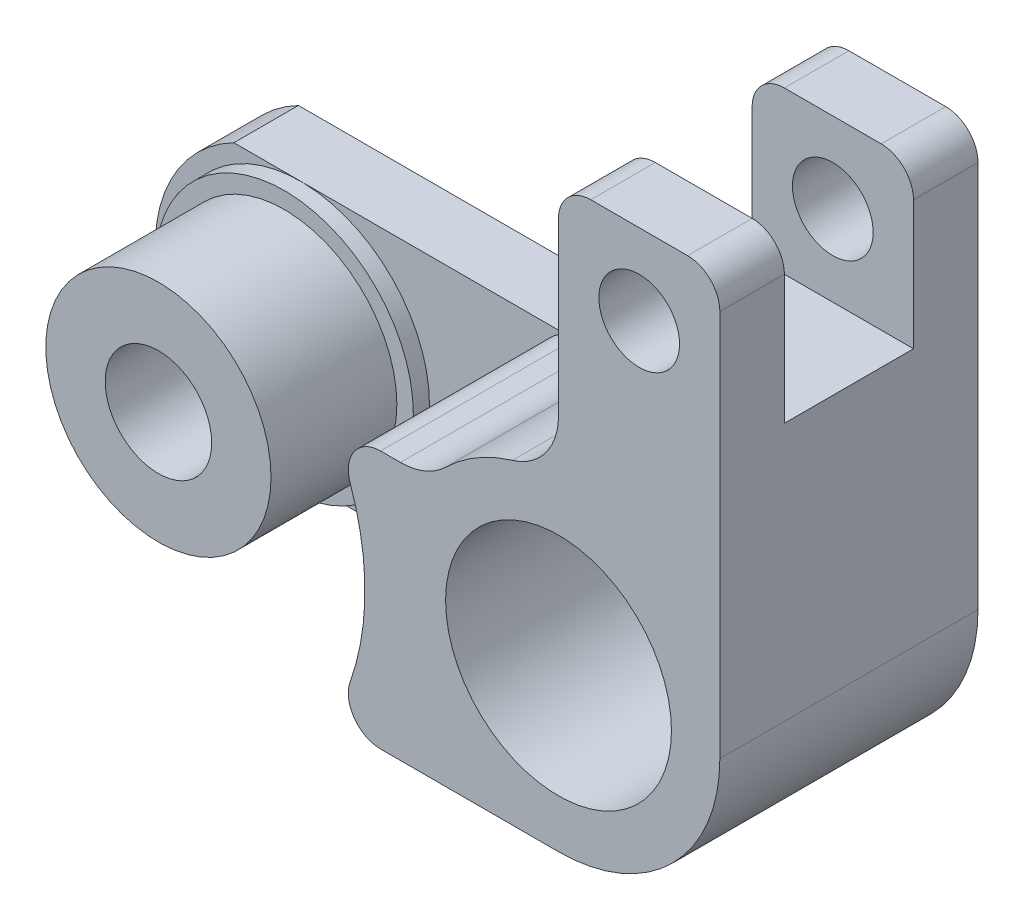
ISO-10303-21;
HEADER;
FILE_DESCRIPTION(('STEP AP214'),'2;1');
FILE_NAME('part.step','',(''),(''),'','','');
FILE_SCHEMA(('AUTOMOTIVE_DESIGN { 1 0 10303 214 1 1 1 1 }'));
ENDSEC;
DATA;
#1=APPLICATION_CONTEXT('core data for automotive mechanical design processes');
#2=APPLICATION_PROTOCOL_DEFINITION('international standard','automotive_design',2000,#1);
#3=PRODUCT_CONTEXT('',#1,'mechanical');
#4=PRODUCT('Part','Part','',(#3));
#5=PRODUCT_RELATED_PRODUCT_CATEGORY('part','',(#4));
#6=PRODUCT_DEFINITION_FORMATION('','',#4);
#7=PRODUCT_DEFINITION_CONTEXT('part definition',#1,'design');
#8=PRODUCT_DEFINITION('design','',#6,#7);
#9=PRODUCT_DEFINITION_SHAPE('','',#8);
#10=(LENGTH_UNIT() NAMED_UNIT(*) SI_UNIT(.MILLI.,.METRE.));
#11=(NAMED_UNIT(*) PLANE_ANGLE_UNIT() SI_UNIT($,.RADIAN.));
#12=(NAMED_UNIT(*) SI_UNIT($,.STERADIAN.) SOLID_ANGLE_UNIT());
#13=UNCERTAINTY_MEASURE_WITH_UNIT(LENGTH_MEASURE(1.E-05),#10,'distance_accuracy_value','');
#14=(GEOMETRIC_REPRESENTATION_CONTEXT(3) GLOBAL_UNCERTAINTY_ASSIGNED_CONTEXT((#13)) GLOBAL_UNIT_ASSIGNED_CONTEXT((#10,
#11,#12)) REPRESENTATION_CONTEXT('',''));
#15=CARTESIAN_POINT('',(0.,0.,0.));
#16=DIRECTION('',(0.,0.,1.));
#17=DIRECTION('',(1.,0.,0.));
#18=AXIS2_PLACEMENT_3D('',#15,#16,#17);
#19=CARTESIAN_POINT('',(5.,4.,2.5));
#20=DIRECTION('',(0.,0.,1.));
#21=DIRECTION('',(1.,0.,0.));
#22=AXIS2_PLACEMENT_3D('',#19,#20,#21);
#23=PLANE('',#22);
#24=CARTESIAN_POINT('',(5.,4.,2.5));
#25=DIRECTION('',(0.,0.,1.));
#26=DIRECTION('',(1.,0.,0.));
#27=AXIS2_PLACEMENT_3D('',#24,#25,#26);
#28=CIRCLE('',#27,4.);
#29=CARTESIAN_POINT('',(9.,4.,2.5));
#30=VERTEX_POINT('',#29);
#31=EDGE_CURVE('E11',#30,#30,#28,.T.);
#32=ORIENTED_EDGE('',*,*,#31,.T.);
#33=EDGE_LOOP('',(#32));
#34=FACE_BOUND('',#33,.T.);
#35=CARTESIAN_POINT('',(5.,4.,2.5));
#36=DIRECTION('',(0.,0.,1.));
#37=DIRECTION('',(1.,0.,0.));
#38=AXIS2_PLACEMENT_3D('',#35,#36,#37);
#39=CIRCLE('',#38,3.49);
#40=CARTESIAN_POINT('',(8.49,4.,2.5));
#41=VERTEX_POINT('',#40);
#42=EDGE_CURVE('E54',#41,#41,#39,.T.);
#43=ORIENTED_EDGE('',*,*,#42,.F.);
#44=EDGE_LOOP('',(#43));
#45=FACE_BOUND('',#44,.T.);
#46=ADVANCED_FACE('F43',(#34,#45),#23,.T.);
#47=CARTESIAN_POINT('',(5.,4.,2.));
#48=DIRECTION('',(0.,0.,1.));
#49=DIRECTION('',(1.,0.,0.));
#50=AXIS2_PLACEMENT_3D('',#47,#48,#49);
#51=PLANE('',#50);
#52=CARTESIAN_POINT('',(5.,4.,2.));
#53=DIRECTION('',(0.,0.,1.));
#54=DIRECTION('',(1.,0.,0.));
#55=AXIS2_PLACEMENT_3D('',#52,#53,#54);
#56=CIRCLE('',#55,4.);
#57=CARTESIAN_POINT('',(9.,4.,2.));
#58=VERTEX_POINT('',#57);
#59=EDGE_CURVE('E47',#58,#58,#56,.T.);
#60=ORIENTED_EDGE('',*,*,#59,.F.);
#61=EDGE_LOOP('',(#60));
#62=FACE_BOUND('',#61,.T.);
#63=CARTESIAN_POINT('',(5.,4.,2.));
#64=DIRECTION('',(0.,0.,1.));
#65=DIRECTION('',(1.,0.,0.));
#66=AXIS2_PLACEMENT_3D('',#63,#64,#65);
#67=CIRCLE('',#66,3.49);
#68=CARTESIAN_POINT('',(8.49,4.,2.));
#69=VERTEX_POINT('',#68);
#70=EDGE_CURVE('E56',#69,#69,#67,.T.);
#71=ORIENTED_EDGE('',*,*,#70,.T.);
#72=EDGE_LOOP('',(#71));
#73=FACE_BOUND('',#72,.T.);
#74=ADVANCED_FACE('F66',(#62,#73),#51,.F.);
#75=CARTESIAN_POINT('',(5.,4.,2.5));
#76=DIRECTION('',(0.,0.,-1.));
#77=DIRECTION('',(-1.,0.,0.));
#78=AXIS2_PLACEMENT_3D('',#75,#76,#77);
#79=CYLINDRICAL_SURFACE('',#78,4.);
#80=ORIENTED_EDGE('',*,*,#59,.T.);
#81=EDGE_LOOP('',(#80));
#82=FACE_BOUND('',#81,.T.);
#83=ORIENTED_EDGE('',*,*,#31,.F.);
#84=EDGE_LOOP('',(#83));
#85=FACE_BOUND('',#84,.T.);
#86=ADVANCED_FACE('F45',(#82,#85),#79,.T.);
#87=CARTESIAN_POINT('',(5.,4.,2.5));
#88=DIRECTION('',(0.,0.,-1.));
#89=DIRECTION('',(-1.,0.,0.));
#90=AXIS2_PLACEMENT_3D('',#87,#88,#89);
#91=CYLINDRICAL_SURFACE('',#90,3.49);
#92=ORIENTED_EDGE('',*,*,#42,.T.);
#93=EDGE_LOOP('',(#92));
#94=FACE_BOUND('',#93,.T.);
#95=ORIENTED_EDGE('',*,*,#70,.F.);
#96=EDGE_LOOP('',(#95));
#97=FACE_BOUND('',#96,.T.);
#98=ADVANCED_FACE('F62',(#94,#97),#91,.F.);
#99=CLOSED_SHELL('',(#46,#74,#86,#98));
#100=MANIFOLD_SOLID_BREP('B2',#99);
#101=CARTESIAN_POINT('',(24.,18.,8.));
#102=DIRECTION('',(0.,-1.,0.));
#103=DIRECTION('',(1.,0.,0.));
#104=AXIS2_PLACEMENT_3D('',#101,#102,#103);
#105=PLANE('',#104);
#106=DIRECTION('',(0.,0.,-1.));
#107=VECTOR('',#106,1.);
#108=CARTESIAN_POINT('',(23.,18.,8.));
#109=LINE('',#108,#107);
#110=CARTESIAN_POINT('',(23.,18.,8.));
#111=VERTEX_POINT('',#110);
#112=CARTESIAN_POINT('',(23.,18.,6.));
#113=VERTEX_POINT('',#112);
#114=EDGE_CURVE('E389',#111,#113,#109,.T.);
#115=ORIENTED_EDGE('',*,*,#114,.T.);
#116=DIRECTION('',(1.,0.,0.));
#117=VECTOR('',#116,1.);
#118=CARTESIAN_POINT('',(19.,18.,6.));
#119=LINE('',#118,#117);
#120=CARTESIAN_POINT('',(20.,18.,6.));
#121=VERTEX_POINT('',#120);
#122=EDGE_CURVE('E284',#121,#113,#119,.T.);
#123=ORIENTED_EDGE('',*,*,#122,.F.);
#124=DIRECTION('',(0.,0.,-1.));
#125=VECTOR('',#124,1.);
#126=CARTESIAN_POINT('',(20.,18.,8.));
#127=LINE('',#126,#125);
#128=CARTESIAN_POINT('',(20.,18.,8.));
#129=VERTEX_POINT('',#128);
#130=EDGE_CURVE('E384',#121,#129,#127,.F.);
#131=ORIENTED_EDGE('',*,*,#130,.T.);
#132=DIRECTION('',(-1.,0.,0.));
#133=VECTOR('',#132,1.);
#134=CARTESIAN_POINT('',(24.,18.,8.));
#135=LINE('',#134,#133);
#136=EDGE_CURVE('E342',#111,#129,#135,.T.);
#137=ORIENTED_EDGE('',*,*,#136,.F.);
#138=EDGE_LOOP('',(#115,#123,#131,#137));
#139=FACE_BOUND('',#138,.T.);
#140=ADVANCED_FACE('F105',(#139),#105,.F.);
#141=CARTESIAN_POINT('',(23.,17.,8.));
#142=DIRECTION('',(0.,0.,-1.));
#143=DIRECTION('',(-1.,0.,0.));
#144=AXIS2_PLACEMENT_3D('',#141,#142,#143);
#145=CYLINDRICAL_SURFACE('',#144,1.);
#146=CARTESIAN_POINT('',(23.,17.,6.));
#147=DIRECTION('',(0.,0.,1.));
#148=DIRECTION('',(1.,0.,0.));
#149=AXIS2_PLACEMENT_3D('',#146,#147,#148);
#150=CIRCLE('',#149,1.);
#151=CARTESIAN_POINT('',(24.,17.,6.));
#152=VERTEX_POINT('',#151);
#153=EDGE_CURVE('E259',#113,#152,#150,.F.);
#154=ORIENTED_EDGE('',*,*,#153,.F.);
#155=ORIENTED_EDGE('',*,*,#114,.F.);
#156=CARTESIAN_POINT('',(23.,17.,8.));
#157=DIRECTION('',(0.,0.,1.));
#158=DIRECTION('',(1.,0.,0.));
#159=AXIS2_PLACEMENT_3D('',#156,#157,#158);
#160=CIRCLE('',#159,1.);
#161=CARTESIAN_POINT('',(24.,17.,8.));
#162=VERTEX_POINT('',#161);
#163=EDGE_CURVE('E405',#162,#111,#160,.T.);
#164=ORIENTED_EDGE('',*,*,#163,.F.);
#165=DIRECTION('',(0.,0.,-1.));
#166=VECTOR('',#165,1.);
#167=CARTESIAN_POINT('',(24.,17.,8.));
#168=LINE('',#167,#166);
#169=EDGE_CURVE('E396',#152,#162,#168,.F.);
#170=ORIENTED_EDGE('',*,*,#169,.F.);
#171=EDGE_LOOP('',(#154,#155,#164,#170));
#172=FACE_BOUND('',#171,.T.);
#173=ADVANCED_FACE('F508',(#172),#145,.T.);
#174=CARTESIAN_POINT('',(20.,17.,8.));
#175=DIRECTION('',(0.,0.,-1.));
#176=DIRECTION('',(-1.,0.,0.));
#177=AXIS2_PLACEMENT_3D('',#174,#175,#176);
#178=CYLINDRICAL_SURFACE('',#177,1.);
#179=CARTESIAN_POINT('',(20.,17.,6.));
#180=DIRECTION('',(0.,0.,1.));
#181=DIRECTION('',(1.,0.,0.));
#182=AXIS2_PLACEMENT_3D('',#179,#180,#181);
#183=CIRCLE('',#182,1.);
#184=CARTESIAN_POINT('',(19.,17.,6.));
#185=VERTEX_POINT('',#184);
#186=EDGE_CURVE('E428',#185,#121,#183,.F.);
#187=ORIENTED_EDGE('',*,*,#186,.F.);
#188=DIRECTION('',(0.,0.,-1.));
#189=VECTOR('',#188,1.);
#190=CARTESIAN_POINT('',(19.,17.,8.));
#191=LINE('',#190,#189);
#192=CARTESIAN_POINT('',(19.,17.,8.));
#193=VERTEX_POINT('',#192);
#194=EDGE_CURVE('E408',#193,#185,#191,.T.);
#195=ORIENTED_EDGE('',*,*,#194,.F.);
#196=CARTESIAN_POINT('',(20.,17.,8.));
#197=DIRECTION('',(0.,0.,1.));
#198=DIRECTION('',(1.,0.,0.));
#199=AXIS2_PLACEMENT_3D('',#196,#197,#198);
#200=CIRCLE('',#199,1.);
#201=EDGE_CURVE('E403',#129,#193,#200,.T.);
#202=ORIENTED_EDGE('',*,*,#201,.F.);
#203=ORIENTED_EDGE('',*,*,#130,.F.);
#204=EDGE_LOOP('',(#187,#195,#202,#203));
#205=FACE_BOUND('',#204,.T.);
#206=ADVANCED_FACE('F515',(#205),#178,.T.);
#207=CARTESIAN_POINT('',(0.,0.,8.));
#208=DIRECTION('',(0.,1.,0.));
#209=DIRECTION('',(0.,0.,1.));
#210=AXIS2_PLACEMENT_3D('',#207,#208,#209);
#211=PLANE('',#210);
#212=DIRECTION('',(1.,0.,0.));
#213=VECTOR('',#212,1.);
#214=CARTESIAN_POINT('',(0.,0.,8.));
#215=LINE('',#214,#213);
#216=CARTESIAN_POINT('',(13.4852813742386,0.,8.));
#217=VERTEX_POINT('',#216);
#218=CARTESIAN_POINT('',(19.,0.,8.));
#219=VERTEX_POINT('',#218);
#220=EDGE_CURVE('E336',#217,#219,#215,.T.);
#221=ORIENTED_EDGE('',*,*,#220,.F.);
#222=DIRECTION('',(0.,0.,1.));
#223=VECTOR('',#222,1.);
#224=CARTESIAN_POINT('',(13.4852813742386,0.,8.));
#225=LINE('',#224,#223);
#226=CARTESIAN_POINT('',(13.4852813742386,0.,2.));
#227=VERTEX_POINT('',#226);
#228=EDGE_CURVE('E418',#217,#227,#225,.F.);
#229=ORIENTED_EDGE('',*,*,#228,.T.);
#230=DIRECTION('',(1.,0.,0.));
#231=VECTOR('',#230,1.);
#232=CARTESIAN_POINT('',(0.,0.,2.));
#233=LINE('',#232,#231);
#234=CARTESIAN_POINT('',(2.93844718719117,0.,2.));
#235=VERTEX_POINT('',#234);
#236=EDGE_CURVE('E318',#235,#227,#233,.T.);
#237=ORIENTED_EDGE('',*,*,#236,.F.);
#238=DIRECTION('',(0.,0.,1.));
#239=VECTOR('',#238,1.);
#240=CARTESIAN_POINT('',(2.93844718719117,0.,0.));
#241=LINE('',#240,#239);
#242=CARTESIAN_POINT('',(2.93844718719117,0.,0.));
#243=VERTEX_POINT('',#242);
#244=EDGE_CURVE('E301',#243,#235,#241,.T.);
#245=ORIENTED_EDGE('',*,*,#244,.F.);
#246=DIRECTION('',(1.,0.,0.));
#247=VECTOR('',#246,1.);
#248=CARTESIAN_POINT('',(0.,0.,0.));
#249=LINE('',#248,#247);
#250=CARTESIAN_POINT('',(19.,0.,0.));
#251=VERTEX_POINT('',#250);
#252=EDGE_CURVE('E334',#243,#251,#249,.T.);
#253=ORIENTED_EDGE('',*,*,#252,.T.);
#254=DIRECTION('',(0.,0.,-1.));
#255=VECTOR('',#254,1.);
#256=CARTESIAN_POINT('',(19.,0.,8.));
#257=LINE('',#256,#255);
#258=EDGE_CURVE('E379',#251,#219,#257,.F.);
#259=ORIENTED_EDGE('',*,*,#258,.T.);
#260=EDGE_LOOP('',(#221,#229,#237,#245,#253,#259));
#261=FACE_BOUND('',#260,.T.);
#262=ADVANCED_FACE('F481',(#261),#211,.F.);
#263=CARTESIAN_POINT('',(24.,0.,8.));
#264=DIRECTION('',(-1.,0.,0.));
#265=DIRECTION('',(0.,0.,1.));
#266=AXIS2_PLACEMENT_3D('',#263,#264,#265);
#267=PLANE('',#266);
#268=DIRECTION('',(0.,0.,-1.));
#269=VECTOR('',#268,1.);
#270=CARTESIAN_POINT('',(24.,13.,2.));
#271=LINE('',#270,#269);
#272=CARTESIAN_POINT('',(24.,13.,6.));
#273=VERTEX_POINT('',#272);
#274=CARTESIAN_POINT('',(24.,13.,2.));
#275=VERTEX_POINT('',#274);
#276=EDGE_CURVE('E270',#273,#275,#271,.T.);
#277=ORIENTED_EDGE('',*,*,#276,.F.);
#278=DIRECTION('',(0.,1.,0.));
#279=VECTOR('',#278,1.);
#280=CARTESIAN_POINT('',(24.,13.,6.));
#281=LINE('',#280,#279);
#282=EDGE_CURVE('E253',#273,#152,#281,.T.);
#283=ORIENTED_EDGE('',*,*,#282,.T.);
#284=ORIENTED_EDGE('',*,*,#169,.T.);
#285=DIRECTION('',(0.,1.,0.));
#286=VECTOR('',#285,1.);
#287=CARTESIAN_POINT('',(24.,0.,8.));
#288=LINE('',#287,#286);
#289=CARTESIAN_POINT('',(24.,5.,8.));
#290=VERTEX_POINT('',#289);
#291=EDGE_CURVE('E338',#290,#162,#288,.T.);
#292=ORIENTED_EDGE('',*,*,#291,.F.);
#293=DIRECTION('',(0.,0.,-1.));
#294=VECTOR('',#293,1.);
#295=CARTESIAN_POINT('',(24.,5.,8.));
#296=LINE('',#295,#294);
#297=CARTESIAN_POINT('',(24.,5.,0.));
#298=VERTEX_POINT('',#297);
#299=EDGE_CURVE('E374',#290,#298,#296,.T.);
#300=ORIENTED_EDGE('',*,*,#299,.T.);
#301=DIRECTION('',(0.,1.,0.));
#302=VECTOR('',#301,1.);
#303=CARTESIAN_POINT('',(24.,0.,0.));
#304=LINE('',#303,#302);
#305=CARTESIAN_POINT('',(24.,17.,0.));
#306=VERTEX_POINT('',#305);
#307=EDGE_CURVE('E353',#298,#306,#304,.T.);
#308=ORIENTED_EDGE('',*,*,#307,.T.);
#309=CARTESIAN_POINT('',(24.,17.,2.));
#310=VERTEX_POINT('',#309);
#311=EDGE_CURVE('E397',#306,#310,#168,.F.);
#312=ORIENTED_EDGE('',*,*,#311,.T.);
#313=DIRECTION('',(0.,1.,0.));
#314=VECTOR('',#313,1.);
#315=CARTESIAN_POINT('',(24.,13.,2.));
#316=LINE('',#315,#314);
#317=EDGE_CURVE('E263',#275,#310,#316,.T.);
#318=ORIENTED_EDGE('',*,*,#317,.F.);
#319=EDGE_LOOP('',(#277,#283,#284,#292,#300,#308,#312,#318));
#320=FACE_BOUND('',#319,.T.);
#321=ADVANCED_FACE('F276',(#320),#267,.F.);
#322=CARTESIAN_POINT('',(20.,18.,0.));
#323=VERTEX_POINT('',#322);
#324=CARTESIAN_POINT('',(20.,18.,2.));
#325=VERTEX_POINT('',#324);
#326=EDGE_CURVE('E385',#323,#325,#127,.F.);
#327=ORIENTED_EDGE('',*,*,#326,.T.);
#328=DIRECTION('',(-1.,0.,0.));
#329=VECTOR('',#328,1.);
#330=CARTESIAN_POINT('',(19.,18.,2.));
#331=LINE('',#330,#329);
#332=CARTESIAN_POINT('',(23.,18.,2.));
#333=VERTEX_POINT('',#332);
#334=EDGE_CURVE('E274',#333,#325,#331,.T.);
#335=ORIENTED_EDGE('',*,*,#334,.F.);
#336=CARTESIAN_POINT('',(23.,18.,0.));
#337=VERTEX_POINT('',#336);
#338=EDGE_CURVE('E388',#333,#337,#109,.T.);
#339=ORIENTED_EDGE('',*,*,#338,.T.);
#340=DIRECTION('',(-1.,0.,0.));
#341=VECTOR('',#340,1.);
#342=CARTESIAN_POINT('',(24.,18.,0.));
#343=LINE('',#342,#341);
#344=EDGE_CURVE('E356',#337,#323,#343,.T.);
#345=ORIENTED_EDGE('',*,*,#344,.T.);
#346=EDGE_LOOP('',(#327,#335,#339,#345));
#347=FACE_BOUND('',#346,.T.);
#348=ADVANCED_FACE('F511',(#347),#105,.F.);
#349=CARTESIAN_POINT('',(19.,18.,8.));
#350=DIRECTION('',(1.,0.,0.));
#351=DIRECTION('',(0.,0.,-1.));
#352=AXIS2_PLACEMENT_3D('',#349,#350,#351);
#353=PLANE('',#352);
#354=DIRECTION('',(0.,-1.,0.));
#355=VECTOR('',#354,1.);
#356=CARTESIAN_POINT('',(19.,18.,0.));
#357=LINE('',#356,#355);
#358=CARTESIAN_POINT('',(19.,17.,0.));
#359=VERTEX_POINT('',#358);
#360=CARTESIAN_POINT('',(19.,11.7082039324994,0.));
#361=VERTEX_POINT('',#360);
#362=EDGE_CURVE('E359',#359,#361,#357,.T.);
#363=ORIENTED_EDGE('',*,*,#362,.T.);
#364=DIRECTION('',(0.,0.,1.));
#365=VECTOR('',#364,1.);
#366=CARTESIAN_POINT('',(19.,11.7082039324994,8.));
#367=LINE('',#366,#365);
#368=CARTESIAN_POINT('',(19.,11.7082039324994,8.));
#369=VERTEX_POINT('',#368);
#370=EDGE_CURVE('E430',#361,#369,#367,.T.);
#371=ORIENTED_EDGE('',*,*,#370,.T.);
#372=DIRECTION('',(0.,-1.,0.));
#373=VECTOR('',#372,1.);
#374=CARTESIAN_POINT('',(19.,18.,8.));
#375=LINE('',#374,#373);
#376=EDGE_CURVE('E345',#193,#369,#375,.T.);
#377=ORIENTED_EDGE('',*,*,#376,.F.);
#378=ORIENTED_EDGE('',*,*,#194,.T.);
#379=DIRECTION('',(0.,1.,0.));
#380=VECTOR('',#379,1.);
#381=CARTESIAN_POINT('',(19.,13.,6.));
#382=LINE('',#381,#380);
#383=CARTESIAN_POINT('',(19.,13.,6.));
#384=VERTEX_POINT('',#383);
#385=EDGE_CURVE('E288',#384,#185,#382,.T.);
#386=ORIENTED_EDGE('',*,*,#385,.F.);
#387=DIRECTION('',(0.,0.,1.));
#388=VECTOR('',#387,1.);
#389=CARTESIAN_POINT('',(19.,13.,2.));
#390=LINE('',#389,#388);
#391=CARTESIAN_POINT('',(19.,13.,2.));
#392=VERTEX_POINT('',#391);
#393=EDGE_CURVE('E264',#392,#384,#390,.T.);
#394=ORIENTED_EDGE('',*,*,#393,.F.);
#395=DIRECTION('',(0.,1.,0.));
#396=VECTOR('',#395,1.);
#397=CARTESIAN_POINT('',(19.,13.,2.));
#398=LINE('',#397,#396);
#399=CARTESIAN_POINT('',(19.,17.,2.));
#400=VERTEX_POINT('',#399);
#401=EDGE_CURVE('E291',#392,#400,#398,.T.);
#402=ORIENTED_EDGE('',*,*,#401,.T.);
#403=EDGE_CURVE('E407',#400,#359,#191,.T.);
#404=ORIENTED_EDGE('',*,*,#403,.T.);
#405=EDGE_LOOP('',(#363,#371,#377,#378,#386,#394,#402,#404));
#406=FACE_BOUND('',#405,.T.);
#407=ADVANCED_FACE('F521',(#406),#353,.F.);
#408=CARTESIAN_POINT('',(19.,8.,8.));
#409=DIRECTION('',(0.,-1.,0.));
#410=DIRECTION('',(1.,0.,0.));
#411=AXIS2_PLACEMENT_3D('',#408,#409,#410);
#412=PLANE('',#411);
#413=DIRECTION('',(-1.,0.,0.));
#414=VECTOR('',#413,1.);
#415=CARTESIAN_POINT('',(19.,8.,8.));
#416=LINE('',#415,#414);
#417=CARTESIAN_POINT('',(14.1010205144336,8.,8.));
#418=VERTEX_POINT('',#417);
#419=CARTESIAN_POINT('',(13.4852813742386,8.,8.));
#420=VERTEX_POINT('',#419);
#421=EDGE_CURVE('E348',#418,#420,#416,.T.);
#422=ORIENTED_EDGE('',*,*,#421,.F.);
#423=DIRECTION('',(0.,0.,1.));
#424=VECTOR('',#423,1.);
#425=CARTESIAN_POINT('',(14.1010205144336,8.,8.));
#426=LINE('',#425,#424);
#427=CARTESIAN_POINT('',(14.1010205144336,8.,0.));
#428=VERTEX_POINT('',#427);
#429=EDGE_CURVE('E437',#418,#428,#426,.F.);
#430=ORIENTED_EDGE('',*,*,#429,.T.);
#431=DIRECTION('',(-1.,0.,0.));
#432=VECTOR('',#431,1.);
#433=CARTESIAN_POINT('',(19.,8.,0.));
#434=LINE('',#433,#432);
#435=CARTESIAN_POINT('',(2.93844718719117,8.,0.));
#436=VERTEX_POINT('',#435);
#437=EDGE_CURVE('E339',#428,#436,#434,.T.);
#438=ORIENTED_EDGE('',*,*,#437,.T.);
#439=DIRECTION('',(0.,0.,1.));
#440=VECTOR('',#439,1.);
#441=CARTESIAN_POINT('',(2.93844718719117,8.,0.));
#442=LINE('',#441,#440);
#443=CARTESIAN_POINT('',(2.93844718719117,8.,2.));
#444=VERTEX_POINT('',#443);
#445=EDGE_CURVE('E300',#436,#444,#442,.T.);
#446=ORIENTED_EDGE('',*,*,#445,.T.);
#447=DIRECTION('',(-1.,0.,0.));
#448=VECTOR('',#447,1.);
#449=CARTESIAN_POINT('',(19.,8.,2.));
#450=LINE('',#449,#448);
#451=CARTESIAN_POINT('',(13.4852813742386,8.,2.));
#452=VERTEX_POINT('',#451);
#453=EDGE_CURVE('E367',#452,#444,#450,.T.);
#454=ORIENTED_EDGE('',*,*,#453,.F.);
#455=DIRECTION('',(0.,0.,1.));
#456=VECTOR('',#455,1.);
#457=CARTESIAN_POINT('',(13.4852813742386,8.,8.));
#458=LINE('',#457,#456);
#459=EDGE_CURVE('E411',#452,#420,#458,.T.);
#460=ORIENTED_EDGE('',*,*,#459,.T.);
#461=EDGE_LOOP('',(#422,#430,#438,#446,#454,#460));
#462=FACE_BOUND('',#461,.T.);
#463=ADVANCED_FACE('F454',(#462),#412,.F.);
#464=CARTESIAN_POINT('',(0.,0.,8.));
#465=DIRECTION('',(0.,0.,1.));
#466=DIRECTION('',(1.,0.,0.));
#467=AXIS2_PLACEMENT_3D('',#464,#465,#466);
#468=PLANE('',#467);
#469=CARTESIAN_POINT('',(21.5,15.5,8.));
#470=DIRECTION('',(0.,0.,1.));
#471=DIRECTION('',(1.,0.,0.));
#472=AXIS2_PLACEMENT_3D('',#469,#470,#471);
#473=CIRCLE('',#472,1.25);
#474=CARTESIAN_POINT('',(22.75,15.5,8.));
#475=VERTEX_POINT('',#474);
#476=EDGE_CURVE('E286',#475,#475,#473,.T.);
#477=ORIENTED_EDGE('',*,*,#476,.F.);
#478=EDGE_LOOP('',(#477));
#479=FACE_BOUND('',#478,.T.);
#480=ORIENTED_EDGE('',*,*,#291,.T.);
#481=ORIENTED_EDGE('',*,*,#163,.T.);
#482=ORIENTED_EDGE('',*,*,#136,.T.);
#483=ORIENTED_EDGE('',*,*,#201,.T.);
#484=ORIENTED_EDGE('',*,*,#376,.T.);
#485=CARTESIAN_POINT('',(17.,11.7082039324994,8.));
#486=DIRECTION('',(0.,0.,1.));
#487=DIRECTION('',(1.,0.,0.));
#488=AXIS2_PLACEMENT_3D('',#485,#486,#487);
#489=CIRCLE('',#488,2.);
#490=CARTESIAN_POINT('',(17.5714285714286,9.79157423749955,8.));
#491=VERTEX_POINT('',#490);
#492=EDGE_CURVE('E439',#369,#491,#489,.F.);
#493=ORIENTED_EDGE('',*,*,#492,.T.);
#494=CARTESIAN_POINT('',(19.,5.,8.));
#495=DIRECTION('',(0.,0.,1.));
#496=DIRECTION('',(1.,0.,0.));
#497=AXIS2_PLACEMENT_3D('',#494,#495,#496);
#498=CIRCLE('',#497,5.);
#499=CARTESIAN_POINT('',(15.5007289388812,8.57142857142857,8.));
#500=VERTEX_POINT('',#499);
#501=EDGE_CURVE('E327',#491,#500,#498,.T.);
#502=ORIENTED_EDGE('',*,*,#501,.T.);
#503=CARTESIAN_POINT('',(14.1010205144336,10.,8.));
#504=DIRECTION('',(0.,0.,1.));
#505=DIRECTION('',(1.,0.,0.));
#506=AXIS2_PLACEMENT_3D('',#503,#504,#505);
#507=CIRCLE('',#506,2.);
#508=EDGE_CURVE('E41',#500,#418,#507,.F.);
#509=ORIENTED_EDGE('',*,*,#508,.T.);
#510=ORIENTED_EDGE('',*,*,#421,.T.);
#511=CARTESIAN_POINT('',(13.4852813742386,7.,8.));
#512=DIRECTION('',(0.,0.,1.));
#513=DIRECTION('',(1.,0.,0.));
#514=AXIS2_PLACEMENT_3D('',#511,#512,#513);
#515=CIRCLE('',#514,1.);
#516=CARTESIAN_POINT('',(12.5424723326565,6.66666666666667,8.));
#517=VERTEX_POINT('',#516);
#518=EDGE_CURVE('E401',#420,#517,#515,.T.);
#519=ORIENTED_EDGE('',*,*,#518,.T.);
#520=CARTESIAN_POINT('',(5.,4.,8.));
#521=DIRECTION('',(0.,0.,1.));
#522=DIRECTION('',(1.,0.,0.));
#523=AXIS2_PLACEMENT_3D('',#520,#521,#522);
#524=CIRCLE('',#523,8.);
#525=CARTESIAN_POINT('',(12.5424723326565,1.33333333333333,8.));
#526=VERTEX_POINT('',#525);
#527=EDGE_CURVE('E350',#526,#517,#524,.T.);
#528=ORIENTED_EDGE('',*,*,#527,.F.);
#529=CARTESIAN_POINT('',(13.4852813742386,1.,8.));
#530=DIRECTION('',(0.,0.,1.));
#531=DIRECTION('',(1.,0.,0.));
#532=AXIS2_PLACEMENT_3D('',#529,#530,#531);
#533=CIRCLE('',#532,1.);
#534=EDGE_CURVE('E399',#526,#217,#533,.T.);
#535=ORIENTED_EDGE('',*,*,#534,.T.);
#536=ORIENTED_EDGE('',*,*,#220,.T.);
#537=CARTESIAN_POINT('',(19.,5.,8.));
#538=DIRECTION('',(0.,0.,1.));
#539=DIRECTION('',(1.,0.,0.));
#540=AXIS2_PLACEMENT_3D('',#537,#538,#539);
#541=CIRCLE('',#540,5.);
#542=EDGE_CURVE('E382',#219,#290,#541,.T.);
#543=ORIENTED_EDGE('',*,*,#542,.T.);
#544=EDGE_LOOP('',(#480,#481,#482,#483,#484,#493,#502,#509,#510,#519,#528,#535,#536,#543));
#545=FACE_BOUND('',#544,.T.);
#546=CARTESIAN_POINT('',(19.,5.,8.));
#547=DIRECTION('',(0.,0.,1.));
#548=DIRECTION('',(1.,0.,0.));
#549=AXIS2_PLACEMENT_3D('',#546,#547,#548);
#550=CIRCLE('',#549,3.5);
#551=CARTESIAN_POINT('',(22.5,5.,8.));
#552=VERTEX_POINT('',#551);
#553=EDGE_CURVE('E328',#552,#552,#550,.T.);
#554=ORIENTED_EDGE('',*,*,#553,.F.);
#555=EDGE_LOOP('',(#554));
#556=FACE_BOUND('',#555,.T.);
#557=ADVANCED_FACE('F458',(#479,#545,#556),#468,.T.);
#558=CARTESIAN_POINT('',(0.,0.,0.));
#559=DIRECTION('',(0.,0.,1.));
#560=DIRECTION('',(1.,0.,0.));
#561=AXIS2_PLACEMENT_3D('',#558,#559,#560);
#562=PLANE('',#561);
#563=CARTESIAN_POINT('',(21.5,15.5,0.));
#564=DIRECTION('',(0.,0.,1.));
#565=DIRECTION('',(1.,0.,0.));
#566=AXIS2_PLACEMENT_3D('',#563,#564,#565);
#567=CIRCLE('',#566,1.25);
#568=CARTESIAN_POINT('',(22.75,15.5,0.));
#569=VERTEX_POINT('',#568);
#570=EDGE_CURVE('E590',#569,#569,#567,.T.);
#571=ORIENTED_EDGE('',*,*,#570,.T.);
#572=EDGE_LOOP('',(#571));
#573=FACE_BOUND('',#572,.T.);
#574=CARTESIAN_POINT('',(5.,4.,0.));
#575=DIRECTION('',(0.,0.,1.));
#576=DIRECTION('',(1.,0.,0.));
#577=AXIS2_PLACEMENT_3D('',#574,#575,#576);
#578=CIRCLE('',#577,1.65);
#579=CARTESIAN_POINT('',(6.65,4.,0.));
#580=VERTEX_POINT('',#579);
#581=EDGE_CURVE('E303',#580,#580,#578,.T.);
#582=ORIENTED_EDGE('',*,*,#581,.T.);
#583=EDGE_LOOP('',(#582));
#584=FACE_BOUND('',#583,.T.);
#585=CARTESIAN_POINT('',(19.,5.,0.));
#586=DIRECTION('',(0.,0.,1.));
#587=DIRECTION('',(1.,0.,0.));
#588=AXIS2_PLACEMENT_3D('',#585,#586,#587);
#589=CIRCLE('',#588,2.5);
#590=CARTESIAN_POINT('',(21.5,5.,0.));
#591=VERTEX_POINT('',#590);
#592=EDGE_CURVE('E320',#591,#591,#589,.T.);
#593=ORIENTED_EDGE('',*,*,#592,.T.);
#594=EDGE_LOOP('',(#593));
#595=FACE_BOUND('',#594,.T.);
#596=ORIENTED_EDGE('',*,*,#344,.F.);
#597=CARTESIAN_POINT('',(23.,17.,0.));
#598=DIRECTION('',(0.,0.,1.));
#599=DIRECTION('',(1.,0.,0.));
#600=AXIS2_PLACEMENT_3D('',#597,#598,#599);
#601=CIRCLE('',#600,1.);
#602=EDGE_CURVE('E394',#337,#306,#601,.F.);
#603=ORIENTED_EDGE('',*,*,#602,.T.);
#604=ORIENTED_EDGE('',*,*,#307,.F.);
#605=CARTESIAN_POINT('',(19.,5.,0.));
#606=DIRECTION('',(0.,0.,1.));
#607=DIRECTION('',(1.,0.,0.));
#608=AXIS2_PLACEMENT_3D('',#605,#606,#607);
#609=CIRCLE('',#608,5.);
#610=EDGE_CURVE('E377',#298,#251,#609,.F.);
#611=ORIENTED_EDGE('',*,*,#610,.T.);
#612=ORIENTED_EDGE('',*,*,#252,.F.);
#613=CARTESIAN_POINT('',(5.,4.,0.));
#614=DIRECTION('',(0.,0.,-1.));
#615=DIRECTION('',(-1.,0.,0.));
#616=AXIS2_PLACEMENT_3D('',#613,#614,#615);
#617=CIRCLE('',#616,4.5);
#618=EDGE_CURVE('E297',#243,#436,#617,.T.);
#619=ORIENTED_EDGE('',*,*,#618,.T.);
#620=ORIENTED_EDGE('',*,*,#437,.F.);
#621=CARTESIAN_POINT('',(14.1010205144336,10.,0.));
#622=DIRECTION('',(0.,0.,1.));
#623=DIRECTION('',(1.,0.,0.));
#624=AXIS2_PLACEMENT_3D('',#621,#622,#623);
#625=CIRCLE('',#624,2.);
#626=CARTESIAN_POINT('',(15.5007289388812,8.57142857142857,0.));
#627=VERTEX_POINT('',#626);
#628=EDGE_CURVE('E114',#428,#627,#625,.T.);
#629=ORIENTED_EDGE('',*,*,#628,.T.);
#630=CARTESIAN_POINT('',(19.,5.,0.));
#631=DIRECTION('',(0.,0.,1.));
#632=DIRECTION('',(1.,0.,0.));
#633=AXIS2_PLACEMENT_3D('',#630,#631,#632);
#634=CIRCLE('',#633,5.);
#635=CARTESIAN_POINT('',(17.5714285714286,9.79157423749955,0.));
#636=VERTEX_POINT('',#635);
#637=EDGE_CURVE('E331',#636,#627,#634,.T.);
#638=ORIENTED_EDGE('',*,*,#637,.F.);
#639=CARTESIAN_POINT('',(17.,11.7082039324994,0.));
#640=DIRECTION('',(0.,0.,1.));
#641=DIRECTION('',(1.,0.,0.));
#642=AXIS2_PLACEMENT_3D('',#639,#640,#641);
#643=CIRCLE('',#642,2.);
#644=EDGE_CURVE('E441',#636,#361,#643,.T.);
#645=ORIENTED_EDGE('',*,*,#644,.T.);
#646=ORIENTED_EDGE('',*,*,#362,.F.);
#647=CARTESIAN_POINT('',(20.,17.,0.));
#648=DIRECTION('',(0.,0.,1.));
#649=DIRECTION('',(1.,0.,0.));
#650=AXIS2_PLACEMENT_3D('',#647,#648,#649);
#651=CIRCLE('',#650,1.);
#652=EDGE_CURVE('E392',#359,#323,#651,.F.);
#653=ORIENTED_EDGE('',*,*,#652,.T.);
#654=EDGE_LOOP('',(#596,#603,#604,#611,#612,#619,#620,#629,#638,#645,#646,#653));
#655=FACE_BOUND('',#654,.T.);
#656=ADVANCED_FACE('F447',(#573,#584,#595,#655),#562,.F.);
#657=CARTESIAN_POINT('',(19.,5.,0.));
#658=DIRECTION('',(0.,0.,1.));
#659=DIRECTION('',(1.,0.,0.));
#660=AXIS2_PLACEMENT_3D('',#657,#658,#659);
#661=CYLINDRICAL_SURFACE('',#660,5.);
#662=ORIENTED_EDGE('',*,*,#501,.F.);
#663=DIRECTION('',(0.,0.,1.));
#664=VECTOR('',#663,1.);
#665=CARTESIAN_POINT('',(17.5714285714286,9.79157423749955,0.));
#666=LINE('',#665,#664);
#667=EDGE_CURVE('E435',#491,#636,#666,.F.);
#668=ORIENTED_EDGE('',*,*,#667,.T.);
#669=ORIENTED_EDGE('',*,*,#637,.T.);
#670=DIRECTION('',(0.,0.,1.));
#671=VECTOR('',#670,1.);
#672=CARTESIAN_POINT('',(15.5007289388812,8.57142857142857,0.));
#673=LINE('',#672,#671);
#674=EDGE_CURVE('E433',#627,#500,#673,.T.);
#675=ORIENTED_EDGE('',*,*,#674,.T.);
#676=EDGE_LOOP('',(#662,#668,#669,#675));
#677=FACE_BOUND('',#676,.T.);
#678=ADVANCED_FACE('F451',(#677),#661,.T.);
#679=CARTESIAN_POINT('',(19.,5.,1.));
#680=DIRECTION('',(0.,0.,1.));
#681=DIRECTION('',(1.,0.,0.));
#682=AXIS2_PLACEMENT_3D('',#679,#680,#681);
#683=CYLINDRICAL_SURFACE('',#682,3.5);
#684=CARTESIAN_POINT('',(19.,5.,1.));
#685=DIRECTION('',(0.,0.,1.));
#686=DIRECTION('',(1.,0.,0.));
#687=AXIS2_PLACEMENT_3D('',#684,#685,#686);
#688=CIRCLE('',#687,3.5);
#689=CARTESIAN_POINT('',(22.5,5.,1.));
#690=VERTEX_POINT('',#689);
#691=EDGE_CURVE('E324',#690,#690,#688,.T.);
#692=ORIENTED_EDGE('',*,*,#691,.F.);
#693=EDGE_LOOP('',(#692));
#694=FACE_BOUND('',#693,.T.);
#695=ORIENTED_EDGE('',*,*,#553,.T.);
#696=EDGE_LOOP('',(#695));
#697=FACE_BOUND('',#696,.T.);
#698=ADVANCED_FACE('F619',(#694,#697),#683,.F.);
#699=CARTESIAN_POINT('',(19.,5.,1.));
#700=DIRECTION('',(0.,0.,1.));
#701=DIRECTION('',(1.,0.,0.));
#702=AXIS2_PLACEMENT_3D('',#699,#700,#701);
#703=PLANE('',#702);
#704=CARTESIAN_POINT('',(19.,5.,1.));
#705=DIRECTION('',(0.,0.,1.));
#706=DIRECTION('',(1.,0.,0.));
#707=AXIS2_PLACEMENT_3D('',#704,#705,#706);
#708=CIRCLE('',#707,2.5);
#709=CARTESIAN_POINT('',(21.5,5.,1.));
#710=VERTEX_POINT('',#709);
#711=EDGE_CURVE('E323',#710,#710,#708,.T.);
#712=ORIENTED_EDGE('',*,*,#711,.F.);
#713=EDGE_LOOP('',(#712));
#714=FACE_BOUND('',#713,.T.);
#715=ORIENTED_EDGE('',*,*,#691,.T.);
#716=EDGE_LOOP('',(#715));
#717=FACE_BOUND('',#716,.T.);
#718=ADVANCED_FACE('F622',(#714,#717),#703,.T.);
#719=CARTESIAN_POINT('',(19.,5.,0.));
#720=DIRECTION('',(0.,0.,1.));
#721=DIRECTION('',(1.,0.,0.));
#722=AXIS2_PLACEMENT_3D('',#719,#720,#721);
#723=CYLINDRICAL_SURFACE('',#722,2.5);
#724=ORIENTED_EDGE('',*,*,#711,.T.);
#725=EDGE_LOOP('',(#724));
#726=FACE_BOUND('',#725,.T.);
#727=ORIENTED_EDGE('',*,*,#592,.F.);
#728=EDGE_LOOP('',(#727));
#729=FACE_BOUND('',#728,.T.);
#730=ADVANCED_FACE('F626',(#726,#729),#723,.F.);
#731=CARTESIAN_POINT('',(5.,4.,2.));
#732=DIRECTION('',(0.,0.,1.));
#733=DIRECTION('',(1.,0.,0.));
#734=AXIS2_PLACEMENT_3D('',#731,#732,#733);
#735=PLANE('',#734);
#736=CARTESIAN_POINT('',(5.,4.,2.));
#737=DIRECTION('',(0.,0.,1.));
#738=DIRECTION('',(1.,0.,0.));
#739=AXIS2_PLACEMENT_3D('',#736,#737,#738);
#740=CIRCLE('',#739,4.5);
#741=EDGE_CURVE('E370',#235,#444,#740,.F.);
#742=ORIENTED_EDGE('',*,*,#741,.F.);
#743=ORIENTED_EDGE('',*,*,#236,.T.);
#744=CARTESIAN_POINT('',(13.4852813742386,1.,2.));
#745=DIRECTION('',(0.,0.,1.));
#746=DIRECTION('',(1.,0.,0.));
#747=AXIS2_PLACEMENT_3D('',#744,#745,#746);
#748=CIRCLE('',#747,1.);
#749=CARTESIAN_POINT('',(12.5424723326565,1.33333333333333,2.));
#750=VERTEX_POINT('',#749);
#751=EDGE_CURVE('E424',#227,#750,#748,.F.);
#752=ORIENTED_EDGE('',*,*,#751,.T.);
#753=CARTESIAN_POINT('',(5.,4.,2.));
#754=DIRECTION('',(0.,0.,1.));
#755=DIRECTION('',(1.,0.,0.));
#756=AXIS2_PLACEMENT_3D('',#753,#754,#755);
#757=CIRCLE('',#756,8.);
#758=CARTESIAN_POINT('',(12.5424723326565,6.66666666666667,2.));
#759=VERTEX_POINT('',#758);
#760=EDGE_CURVE('E312',#750,#759,#757,.T.);
#761=ORIENTED_EDGE('',*,*,#760,.T.);
#762=CARTESIAN_POINT('',(13.4852813742386,7.,2.));
#763=DIRECTION('',(0.,0.,1.));
#764=DIRECTION('',(1.,0.,0.));
#765=AXIS2_PLACEMENT_3D('',#762,#763,#764);
#766=CIRCLE('',#765,1.);
#767=EDGE_CURVE('E421',#759,#452,#766,.F.);
#768=ORIENTED_EDGE('',*,*,#767,.T.);
#769=ORIENTED_EDGE('',*,*,#453,.T.);
#770=EDGE_LOOP('',(#742,#743,#752,#761,#768,#769));
#771=FACE_BOUND('',#770,.T.);
#772=CARTESIAN_POINT('',(5.,4.,2.));
#773=DIRECTION('',(0.,0.,1.));
#774=DIRECTION('',(1.,0.,0.));
#775=AXIS2_PLACEMENT_3D('',#772,#773,#774);
#776=CIRCLE('',#775,3.49);
#777=CARTESIAN_POINT('',(8.49,4.,2.));
#778=VERTEX_POINT('',#777);
#779=EDGE_CURVE('E313',#778,#778,#776,.T.);
#780=ORIENTED_EDGE('',*,*,#779,.F.);
#781=EDGE_LOOP('',(#780));
#782=FACE_BOUND('',#781,.T.);
#783=ADVANCED_FACE('F471',(#771,#782),#735,.T.);
#784=CARTESIAN_POINT('',(5.,4.,2.));
#785=DIRECTION('',(0.,0.,1.));
#786=DIRECTION('',(1.,0.,0.));
#787=AXIS2_PLACEMENT_3D('',#784,#785,#786);
#788=CYLINDRICAL_SURFACE('',#787,8.);
#789=ORIENTED_EDGE('',*,*,#527,.T.);
#790=DIRECTION('',(0.,0.,1.));
#791=VECTOR('',#790,1.);
#792=CARTESIAN_POINT('',(12.5424723326565,6.66666666666667,2.));
#793=LINE('',#792,#791);
#794=EDGE_CURVE('E416',#517,#759,#793,.F.);
#795=ORIENTED_EDGE('',*,*,#794,.T.);
#796=ORIENTED_EDGE('',*,*,#760,.F.);
#797=DIRECTION('',(0.,0.,1.));
#798=VECTOR('',#797,1.);
#799=CARTESIAN_POINT('',(12.5424723326565,1.33333333333333,2.));
#800=LINE('',#799,#798);
#801=EDGE_CURVE('E414',#750,#526,#800,.T.);
#802=ORIENTED_EDGE('',*,*,#801,.T.);
#803=EDGE_LOOP('',(#789,#795,#796,#802));
#804=FACE_BOUND('',#803,.T.);
#805=ADVANCED_FACE('F467',(#804),#788,.F.);
#806=CARTESIAN_POINT('',(5.,4.,6.4));
#807=DIRECTION('',(0.,0.,-1.));
#808=DIRECTION('',(-1.,0.,0.));
#809=AXIS2_PLACEMENT_3D('',#806,#807,#808);
#810=CYLINDRICAL_SURFACE('',#809,3.49);
#811=CARTESIAN_POINT('',(5.,4.,6.4));
#812=DIRECTION('',(0.,0.,1.));
#813=DIRECTION('',(1.,0.,0.));
#814=AXIS2_PLACEMENT_3D('',#811,#812,#813);
#815=CIRCLE('',#814,3.49);
#816=CARTESIAN_POINT('',(8.49,4.,6.4));
#817=VERTEX_POINT('',#816);
#818=EDGE_CURVE('E309',#817,#817,#815,.T.);
#819=ORIENTED_EDGE('',*,*,#818,.F.);
#820=EDGE_LOOP('',(#819));
#821=FACE_BOUND('',#820,.T.);
#822=ORIENTED_EDGE('',*,*,#779,.T.);
#823=EDGE_LOOP('',(#822));
#824=FACE_BOUND('',#823,.T.);
#825=ADVANCED_FACE('F633',(#821,#824),#810,.T.);
#826=CARTESIAN_POINT('',(5.,4.,6.4));
#827=DIRECTION('',(0.,0.,1.));
#828=DIRECTION('',(1.,0.,0.));
#829=AXIS2_PLACEMENT_3D('',#826,#827,#828);
#830=PLANE('',#829);
#831=CARTESIAN_POINT('',(5.,4.,6.4));
#832=DIRECTION('',(0.,0.,1.));
#833=DIRECTION('',(1.,0.,0.));
#834=AXIS2_PLACEMENT_3D('',#831,#832,#833);
#835=CIRCLE('',#834,1.65);
#836=CARTESIAN_POINT('',(6.65,4.,6.4));
#837=VERTEX_POINT('',#836);
#838=EDGE_CURVE('E308',#837,#837,#835,.T.);
#839=ORIENTED_EDGE('',*,*,#838,.F.);
#840=EDGE_LOOP('',(#839));
#841=FACE_BOUND('',#840,.T.);
#842=ORIENTED_EDGE('',*,*,#818,.T.);
#843=EDGE_LOOP('',(#842));
#844=FACE_BOUND('',#843,.T.);
#845=ADVANCED_FACE('F503',(#841,#844),#830,.T.);
#846=CARTESIAN_POINT('',(5.,4.,0.));
#847=DIRECTION('',(0.,0.,1.));
#848=DIRECTION('',(1.,0.,0.));
#849=AXIS2_PLACEMENT_3D('',#846,#847,#848);
#850=CYLINDRICAL_SURFACE('',#849,1.65);
#851=ORIENTED_EDGE('',*,*,#838,.T.);
#852=EDGE_LOOP('',(#851));
#853=FACE_BOUND('',#852,.T.);
#854=ORIENTED_EDGE('',*,*,#581,.F.);
#855=EDGE_LOOP('',(#854));
#856=FACE_BOUND('',#855,.T.);
#857=ADVANCED_FACE('F495',(#853,#856),#850,.F.);
#858=CARTESIAN_POINT('',(5.,4.,0.));
#859=DIRECTION('',(0.,0.,1.));
#860=DIRECTION('',(1.,0.,0.));
#861=AXIS2_PLACEMENT_3D('',#858,#859,#860);
#862=CYLINDRICAL_SURFACE('',#861,4.5);
#863=ORIENTED_EDGE('',*,*,#741,.T.);
#864=ORIENTED_EDGE('',*,*,#445,.F.);
#865=ORIENTED_EDGE('',*,*,#618,.F.);
#866=ORIENTED_EDGE('',*,*,#244,.T.);
#867=EDGE_LOOP('',(#863,#864,#865,#866));
#868=FACE_BOUND('',#867,.T.);
#869=ADVANCED_FACE('F493',(#868),#862,.T.);
#870=CARTESIAN_POINT('',(19.,5.,8.));
#871=DIRECTION('',(0.,0.,-1.));
#872=DIRECTION('',(-1.,0.,0.));
#873=AXIS2_PLACEMENT_3D('',#870,#871,#872);
#874=CYLINDRICAL_SURFACE('',#873,5.);
#875=ORIENTED_EDGE('',*,*,#542,.F.);
#876=ORIENTED_EDGE('',*,*,#258,.F.);
#877=ORIENTED_EDGE('',*,*,#610,.F.);
#878=ORIENTED_EDGE('',*,*,#299,.F.);
#879=EDGE_LOOP('',(#875,#876,#877,#878));
#880=FACE_BOUND('',#879,.T.);
#881=ADVANCED_FACE('F490',(#880),#874,.T.);
#882=CARTESIAN_POINT('',(23.,17.,2.));
#883=DIRECTION('',(0.,0.,-1.));
#884=DIRECTION('',(-1.,0.,0.));
#885=AXIS2_PLACEMENT_3D('',#882,#883,#884);
#886=CIRCLE('',#885,1.);
#887=EDGE_CURVE('E290',#310,#333,#886,.F.);
#888=ORIENTED_EDGE('',*,*,#887,.F.);
#889=ORIENTED_EDGE('',*,*,#311,.F.);
#890=ORIENTED_EDGE('',*,*,#602,.F.);
#891=ORIENTED_EDGE('',*,*,#338,.F.);
#892=EDGE_LOOP('',(#888,#889,#890,#891));
#893=FACE_BOUND('',#892,.T.);
#894=ADVANCED_FACE('F501',(#893),#145,.T.);
#895=CARTESIAN_POINT('',(20.,17.,2.));
#896=DIRECTION('',(0.,0.,-1.));
#897=DIRECTION('',(-1.,0.,0.));
#898=AXIS2_PLACEMENT_3D('',#895,#896,#897);
#899=CIRCLE('',#898,1.);
#900=EDGE_CURVE('E426',#325,#400,#899,.F.);
#901=ORIENTED_EDGE('',*,*,#900,.F.);
#902=ORIENTED_EDGE('',*,*,#326,.F.);
#903=ORIENTED_EDGE('',*,*,#652,.F.);
#904=ORIENTED_EDGE('',*,*,#403,.F.);
#905=EDGE_LOOP('',(#901,#902,#903,#904));
#906=FACE_BOUND('',#905,.T.);
#907=ADVANCED_FACE('F534',(#906),#178,.T.);
#908=CARTESIAN_POINT('',(13.4852813742386,7.,2.));
#909=DIRECTION('',(0.,0.,1.));
#910=DIRECTION('',(1.,0.,0.));
#911=AXIS2_PLACEMENT_3D('',#908,#909,#910);
#912=CYLINDRICAL_SURFACE('',#911,1.);
#913=ORIENTED_EDGE('',*,*,#767,.F.);
#914=ORIENTED_EDGE('',*,*,#794,.F.);
#915=ORIENTED_EDGE('',*,*,#518,.F.);
#916=ORIENTED_EDGE('',*,*,#459,.F.);
#917=EDGE_LOOP('',(#913,#914,#915,#916));
#918=FACE_BOUND('',#917,.T.);
#919=ADVANCED_FACE('F464',(#918),#912,.T.);
#920=CARTESIAN_POINT('',(13.4852813742386,1.,2.));
#921=DIRECTION('',(0.,0.,1.));
#922=DIRECTION('',(1.,0.,0.));
#923=AXIS2_PLACEMENT_3D('',#920,#921,#922);
#924=CYLINDRICAL_SURFACE('',#923,1.);
#925=ORIENTED_EDGE('',*,*,#534,.F.);
#926=ORIENTED_EDGE('',*,*,#801,.F.);
#927=ORIENTED_EDGE('',*,*,#751,.F.);
#928=ORIENTED_EDGE('',*,*,#228,.F.);
#929=EDGE_LOOP('',(#925,#926,#927,#928));
#930=FACE_BOUND('',#929,.T.);
#931=ADVANCED_FACE('F478',(#930),#924,.T.);
#932=CARTESIAN_POINT('',(19.,13.,6.));
#933=DIRECTION('',(0.,0.,1.));
#934=DIRECTION('',(1.,0.,0.));
#935=AXIS2_PLACEMENT_3D('',#932,#933,#934);
#936=PLANE('',#935);
#937=CARTESIAN_POINT('',(21.5,15.5,6.));
#938=DIRECTION('',(0.,0.,1.));
#939=DIRECTION('',(1.,0.,0.));
#940=AXIS2_PLACEMENT_3D('',#937,#938,#939);
#941=CIRCLE('',#940,1.25);
#942=CARTESIAN_POINT('',(22.75,15.5,6.));
#943=VERTEX_POINT('',#942);
#944=EDGE_CURVE('E585',#943,#943,#941,.T.);
#945=ORIENTED_EDGE('',*,*,#944,.T.);
#946=EDGE_LOOP('',(#945));
#947=FACE_BOUND('',#946,.T.);
#948=ORIENTED_EDGE('',*,*,#153,.T.);
#949=ORIENTED_EDGE('',*,*,#282,.F.);
#950=DIRECTION('',(1.,0.,0.));
#951=VECTOR('',#950,1.);
#952=CARTESIAN_POINT('',(19.,13.,6.));
#953=LINE('',#952,#951);
#954=EDGE_CURVE('E256',#384,#273,#953,.T.);
#955=ORIENTED_EDGE('',*,*,#954,.F.);
#956=ORIENTED_EDGE('',*,*,#385,.T.);
#957=ORIENTED_EDGE('',*,*,#186,.T.);
#958=ORIENTED_EDGE('',*,*,#122,.T.);
#959=EDGE_LOOP('',(#948,#949,#955,#956,#957,#958));
#960=FACE_BOUND('',#959,.T.);
#961=ADVANCED_FACE('F255',(#947,#960),#936,.F.);
#962=CARTESIAN_POINT('',(19.,13.,2.));
#963=DIRECTION('',(0.,0.,-1.));
#964=DIRECTION('',(-1.,0.,0.));
#965=AXIS2_PLACEMENT_3D('',#962,#963,#964);
#966=PLANE('',#965);
#967=CARTESIAN_POINT('',(21.5,15.5,2.));
#968=DIRECTION('',(0.,0.,-1.));
#969=DIRECTION('',(-1.,0.,0.));
#970=AXIS2_PLACEMENT_3D('',#967,#968,#969);
#971=CIRCLE('',#970,1.25);
#972=CARTESIAN_POINT('',(20.25,15.5,2.));
#973=VERTEX_POINT('',#972);
#974=EDGE_CURVE('E109',#973,#973,#971,.T.);
#975=ORIENTED_EDGE('',*,*,#974,.T.);
#976=EDGE_LOOP('',(#975));
#977=FACE_BOUND('',#976,.T.);
#978=ORIENTED_EDGE('',*,*,#887,.T.);
#979=ORIENTED_EDGE('',*,*,#334,.T.);
#980=ORIENTED_EDGE('',*,*,#900,.T.);
#981=ORIENTED_EDGE('',*,*,#401,.F.);
#982=DIRECTION('',(-1.,0.,0.));
#983=VECTOR('',#982,1.);
#984=CARTESIAN_POINT('',(19.,13.,2.));
#985=LINE('',#984,#983);
#986=EDGE_CURVE('E278',#275,#392,#985,.T.);
#987=ORIENTED_EDGE('',*,*,#986,.F.);
#988=ORIENTED_EDGE('',*,*,#317,.T.);
#989=EDGE_LOOP('',(#978,#979,#980,#981,#987,#988));
#990=FACE_BOUND('',#989,.T.);
#991=ADVANCED_FACE('F538',(#977,#990),#966,.F.);
#992=CARTESIAN_POINT('',(0.,13.,0.));
#993=DIRECTION('',(0.,-1.,0.));
#994=DIRECTION('',(0.,0.,-1.));
#995=AXIS2_PLACEMENT_3D('',#992,#993,#994);
#996=PLANE('',#995);
#997=ORIENTED_EDGE('',*,*,#954,.T.);
#998=ORIENTED_EDGE('',*,*,#276,.T.);
#999=ORIENTED_EDGE('',*,*,#986,.T.);
#1000=ORIENTED_EDGE('',*,*,#393,.T.);
#1001=EDGE_LOOP('',(#997,#998,#999,#1000));
#1002=FACE_BOUND('',#1001,.T.);
#1003=ADVANCED_FACE('F268',(#1002),#996,.F.);
#1004=CARTESIAN_POINT('',(17.,11.7082039324994,0.));
#1005=DIRECTION('',(0.,0.,1.));
#1006=DIRECTION('',(1.,0.,0.));
#1007=AXIS2_PLACEMENT_3D('',#1004,#1005,#1006);
#1008=CYLINDRICAL_SURFACE('',#1007,2.);
#1009=ORIENTED_EDGE('',*,*,#644,.F.);
#1010=ORIENTED_EDGE('',*,*,#667,.F.);
#1011=ORIENTED_EDGE('',*,*,#492,.F.);
#1012=ORIENTED_EDGE('',*,*,#370,.F.);
#1013=EDGE_LOOP('',(#1009,#1010,#1011,#1012));
#1014=FACE_BOUND('',#1013,.T.);
#1015=ADVANCED_FACE('F550',(#1014),#1008,.F.);
#1016=CARTESIAN_POINT('',(14.1010205144336,10.,0.));
#1017=DIRECTION('',(0.,0.,1.));
#1018=DIRECTION('',(1.,0.,0.));
#1019=AXIS2_PLACEMENT_3D('',#1016,#1017,#1018);
#1020=CYLINDRICAL_SURFACE('',#1019,2.);
#1021=ORIENTED_EDGE('',*,*,#508,.F.);
#1022=ORIENTED_EDGE('',*,*,#674,.F.);
#1023=ORIENTED_EDGE('',*,*,#628,.F.);
#1024=ORIENTED_EDGE('',*,*,#429,.F.);
#1025=EDGE_LOOP('',(#1021,#1022,#1023,#1024));
#1026=FACE_BOUND('',#1025,.T.);
#1027=ADVANCED_FACE('F107',(#1026),#1020,.F.);
#1028=CARTESIAN_POINT('',(21.5,15.5,0.));
#1029=DIRECTION('',(0.,0.,1.));
#1030=DIRECTION('',(1.,0.,0.));
#1031=AXIS2_PLACEMENT_3D('',#1028,#1029,#1030);
#1032=CYLINDRICAL_SURFACE('',#1031,1.25);
#1033=ORIENTED_EDGE('',*,*,#570,.F.);
#1034=EDGE_LOOP('',(#1033));
#1035=FACE_BOUND('',#1034,.T.);
#1036=ORIENTED_EDGE('',*,*,#974,.F.);
#1037=EDGE_LOOP('',(#1036));
#1038=FACE_BOUND('',#1037,.T.);
#1039=ADVANCED_FACE('F570',(#1035,#1038),#1032,.F.);
#1040=ORIENTED_EDGE('',*,*,#476,.T.);
#1041=EDGE_LOOP('',(#1040));
#1042=FACE_BOUND('',#1041,.T.);
#1043=ORIENTED_EDGE('',*,*,#944,.F.);
#1044=EDGE_LOOP('',(#1043));
#1045=FACE_BOUND('',#1044,.T.);
#1046=ADVANCED_FACE('F578',(#1042,#1045),#1032,.F.);
#1047=CLOSED_SHELL('',(#140,#173,#206,#262,#321,#348,#407,#463,#557,#656,#678,#698,#718,#730,
#783,#805,#825,#845,#857,#869,#881,#894,#907,#919,#931,#961,#991,#1003,#1015,#1027,#1039,#1046));
#1048=MANIFOLD_SOLID_BREP('B6',#1047);
#1049=ADVANCED_BREP_SHAPE_REPRESENTATION('',(#18,#100,#1048),#14);
#1050=SHAPE_DEFINITION_REPRESENTATION(#9,#1049);
ENDSEC;
END-ISO-10303-21;
